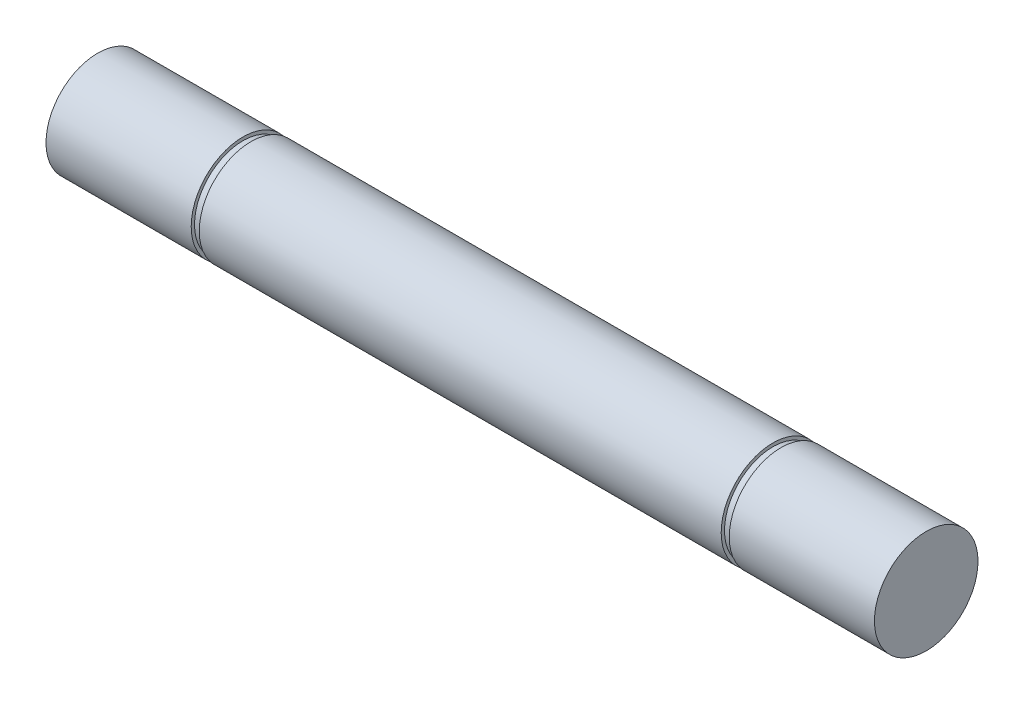
ISO-10303-21;
HEADER;
FILE_DESCRIPTION(('STEP AP214'),'2;1');
FILE_NAME('part.step','',(''),(''),'','','');
FILE_SCHEMA(('AUTOMOTIVE_DESIGN { 1 0 10303 214 1 1 1 1 }'));
ENDSEC;
DATA;
#1=APPLICATION_CONTEXT('core data for automotive mechanical design processes');
#2=APPLICATION_PROTOCOL_DEFINITION('international standard','automotive_design',2000,#1);
#3=PRODUCT_CONTEXT('',#1,'mechanical');
#4=PRODUCT('Part','Part','',(#3));
#5=PRODUCT_RELATED_PRODUCT_CATEGORY('part','',(#4));
#6=PRODUCT_DEFINITION_FORMATION('','',#4);
#7=PRODUCT_DEFINITION_CONTEXT('part definition',#1,'design');
#8=PRODUCT_DEFINITION('design','',#6,#7);
#9=PRODUCT_DEFINITION_SHAPE('','',#8);
#10=(LENGTH_UNIT() NAMED_UNIT(*) SI_UNIT(.MILLI.,.METRE.));
#11=(NAMED_UNIT(*) PLANE_ANGLE_UNIT() SI_UNIT($,.RADIAN.));
#12=(NAMED_UNIT(*) SI_UNIT($,.STERADIAN.) SOLID_ANGLE_UNIT());
#13=UNCERTAINTY_MEASURE_WITH_UNIT(LENGTH_MEASURE(1.E-05),#10,'distance_accuracy_value','');
#14=(GEOMETRIC_REPRESENTATION_CONTEXT(3) GLOBAL_UNCERTAINTY_ASSIGNED_CONTEXT((#13)) GLOBAL_UNIT_ASSIGNED_CONTEXT((#10,
#11,#12)) REPRESENTATION_CONTEXT('',''));
#15=CARTESIAN_POINT('',(0.,0.,0.));
#16=DIRECTION('',(0.,0.,1.));
#17=DIRECTION('',(1.,0.,0.));
#18=AXIS2_PLACEMENT_3D('',#15,#16,#17);
#19=CARTESIAN_POINT('',(101.6,0.,0.));
#20=DIRECTION('',(-1.,0.,0.));
#21=DIRECTION('',(0.,0.,1.));
#22=AXIS2_PLACEMENT_3D('',#19,#20,#21);
#23=CYLINDRICAL_SURFACE('',#22,6.35);
#24=CARTESIAN_POINT('',(18.796,0.,0.));
#25=DIRECTION('',(-1.,0.,0.));
#26=DIRECTION('',(0.,0.,1.));
#27=AXIS2_PLACEMENT_3D('',#24,#25,#26);
#28=CIRCLE('',#27,6.35);
#29=CARTESIAN_POINT('',(18.796,0.,6.35));
#30=VERTEX_POINT('',#29);
#31=EDGE_CURVE('E52',#30,#30,#28,.T.);
#32=ORIENTED_EDGE('',*,*,#31,.F.);
#33=EDGE_LOOP('',(#32));
#34=FACE_BOUND('',#33,.T.);
#35=CARTESIAN_POINT('',(82.804,0.,0.));
#36=DIRECTION('',(-1.,0.,0.));
#37=DIRECTION('',(0.,0.,1.));
#38=AXIS2_PLACEMENT_3D('',#35,#36,#37);
#39=CIRCLE('',#38,6.35);
#40=CARTESIAN_POINT('',(82.804,0.,6.35));
#41=VERTEX_POINT('',#40);
#42=EDGE_CURVE('E68',#41,#41,#39,.T.);
#43=ORIENTED_EDGE('',*,*,#42,.T.);
#44=EDGE_LOOP('',(#43));
#45=FACE_BOUND('',#44,.T.);
#46=ADVANCED_FACE('F37',(#34,#45),#23,.T.);
#47=CARTESIAN_POINT('',(17.8054,0.,0.));
#48=DIRECTION('',(-1.,0.,0.));
#49=DIRECTION('',(0.,0.,1.));
#50=AXIS2_PLACEMENT_3D('',#47,#48,#49);
#51=CIRCLE('',#50,6.35);
#52=CARTESIAN_POINT('',(17.8054,0.,6.35));
#53=VERTEX_POINT('',#52);
#54=EDGE_CURVE('E50',#53,#53,#51,.T.);
#55=ORIENTED_EDGE('',*,*,#54,.T.);
#56=EDGE_LOOP('',(#55));
#57=FACE_BOUND('',#56,.T.);
#58=CARTESIAN_POINT('',(0.,0.,0.));
#59=DIRECTION('',(1.,0.,0.));
#60=DIRECTION('',(0.,0.,-1.));
#61=AXIS2_PLACEMENT_3D('',#58,#59,#60);
#62=CIRCLE('',#61,6.35);
#63=CARTESIAN_POINT('',(0.,0.,-6.35));
#64=VERTEX_POINT('',#63);
#65=EDGE_CURVE('E41',#64,#64,#62,.T.);
#66=ORIENTED_EDGE('',*,*,#65,.T.);
#67=EDGE_LOOP('',(#66));
#68=FACE_BOUND('',#67,.T.);
#69=ADVANCED_FACE('F39',(#57,#68),#23,.T.);
#70=CARTESIAN_POINT('',(0.,0.,0.));
#71=DIRECTION('',(1.,0.,0.));
#72=DIRECTION('',(0.,0.,-1.));
#73=AXIS2_PLACEMENT_3D('',#70,#71,#72);
#74=PLANE('',#73);
#75=ORIENTED_EDGE('',*,*,#65,.F.);
#76=EDGE_LOOP('',(#75));
#77=FACE_BOUND('',#76,.T.);
#78=ADVANCED_FACE('F104',(#77),#74,.F.);
#79=CARTESIAN_POINT('',(17.8054,0.,0.));
#80=DIRECTION('',(-1.,0.,0.));
#81=DIRECTION('',(0.,0.,1.));
#82=AXIS2_PLACEMENT_3D('',#79,#80,#81);
#83=PLANE('',#82);
#84=ORIENTED_EDGE('',*,*,#54,.F.);
#85=EDGE_LOOP('',(#84));
#86=FACE_BOUND('',#85,.T.);
#87=CARTESIAN_POINT('',(17.8054,0.,0.));
#88=DIRECTION('',(-1.,0.,0.));
#89=DIRECTION('',(0.,0.,1.));
#90=AXIS2_PLACEMENT_3D('',#87,#88,#89);
#91=CIRCLE('',#90,5.9436);
#92=CARTESIAN_POINT('',(17.8054,0.,5.9436));
#93=VERTEX_POINT('',#92);
#94=EDGE_CURVE('E56',#93,#93,#91,.T.);
#95=ORIENTED_EDGE('',*,*,#94,.T.);
#96=EDGE_LOOP('',(#95));
#97=FACE_BOUND('',#96,.T.);
#98=ADVANCED_FACE('F126',(#86,#97),#83,.F.);
#99=CARTESIAN_POINT('',(18.796,0.,0.));
#100=DIRECTION('',(-1.,0.,0.));
#101=DIRECTION('',(0.,0.,1.));
#102=AXIS2_PLACEMENT_3D('',#99,#100,#101);
#103=PLANE('',#102);
#104=ORIENTED_EDGE('',*,*,#31,.T.);
#105=EDGE_LOOP('',(#104));
#106=FACE_BOUND('',#105,.T.);
#107=CARTESIAN_POINT('',(18.796,0.,0.));
#108=DIRECTION('',(-1.,0.,0.));
#109=DIRECTION('',(0.,0.,1.));
#110=AXIS2_PLACEMENT_3D('',#107,#108,#109);
#111=CIRCLE('',#110,5.9436);
#112=CARTESIAN_POINT('',(18.796,0.,5.9436));
#113=VERTEX_POINT('',#112);
#114=EDGE_CURVE('E60',#113,#113,#111,.T.);
#115=ORIENTED_EDGE('',*,*,#114,.F.);
#116=EDGE_LOOP('',(#115));
#117=FACE_BOUND('',#116,.T.);
#118=ADVANCED_FACE('F124',(#106,#117),#103,.T.);
#119=CARTESIAN_POINT('',(17.8054,0.,0.));
#120=DIRECTION('',(1.,0.,0.));
#121=DIRECTION('',(0.,0.,-1.));
#122=AXIS2_PLACEMENT_3D('',#119,#120,#121);
#123=CYLINDRICAL_SURFACE('',#122,5.9436);
#124=ORIENTED_EDGE('',*,*,#94,.F.);
#125=EDGE_LOOP('',(#124));
#126=FACE_BOUND('',#125,.T.);
#127=ORIENTED_EDGE('',*,*,#114,.T.);
#128=EDGE_LOOP('',(#127));
#129=FACE_BOUND('',#128,.T.);
#130=ADVANCED_FACE('F91',(#126,#129),#123,.T.);
#131=CARTESIAN_POINT('',(83.7946,0.,0.));
#132=DIRECTION('',(1.,0.,0.));
#133=DIRECTION('',(0.,0.,1.));
#134=AXIS2_PLACEMENT_3D('',#131,#132,#133);
#135=PLANE('',#134);
#136=CARTESIAN_POINT('',(83.7946,0.,0.));
#137=DIRECTION('',(-1.,0.,0.));
#138=DIRECTION('',(0.,0.,1.));
#139=AXIS2_PLACEMENT_3D('',#136,#137,#138);
#140=CIRCLE('',#139,5.9436);
#141=CARTESIAN_POINT('',(83.7946,0.,5.9436));
#142=VERTEX_POINT('',#141);
#143=EDGE_CURVE('E72',#142,#142,#140,.T.);
#144=ORIENTED_EDGE('',*,*,#143,.F.);
#145=EDGE_LOOP('',(#144));
#146=FACE_BOUND('',#145,.T.);
#147=CARTESIAN_POINT('',(83.7946,0.,0.));
#148=DIRECTION('',(-1.,0.,0.));
#149=DIRECTION('',(0.,0.,1.));
#150=AXIS2_PLACEMENT_3D('',#147,#148,#149);
#151=CIRCLE('',#150,6.35);
#152=CARTESIAN_POINT('',(83.7946,0.,6.35));
#153=VERTEX_POINT('',#152);
#154=EDGE_CURVE('E64',#153,#153,#151,.T.);
#155=ORIENTED_EDGE('',*,*,#154,.T.);
#156=EDGE_LOOP('',(#155));
#157=FACE_BOUND('',#156,.T.);
#158=ADVANCED_FACE('F87',(#146,#157),#135,.F.);
#159=CARTESIAN_POINT('',(82.804,0.,0.));
#160=DIRECTION('',(1.,0.,0.));
#161=DIRECTION('',(0.,0.,1.));
#162=AXIS2_PLACEMENT_3D('',#159,#160,#161);
#163=PLANE('',#162);
#164=CARTESIAN_POINT('',(82.804,0.,0.));
#165=DIRECTION('',(-1.,0.,0.));
#166=DIRECTION('',(0.,0.,1.));
#167=AXIS2_PLACEMENT_3D('',#164,#165,#166);
#168=CIRCLE('',#167,5.9436);
#169=CARTESIAN_POINT('',(82.804,0.,5.9436));
#170=VERTEX_POINT('',#169);
#171=EDGE_CURVE('E76',#170,#170,#168,.T.);
#172=ORIENTED_EDGE('',*,*,#171,.T.);
#173=EDGE_LOOP('',(#172));
#174=FACE_BOUND('',#173,.T.);
#175=ORIENTED_EDGE('',*,*,#42,.F.);
#176=EDGE_LOOP('',(#175));
#177=FACE_BOUND('',#176,.T.);
#178=ADVANCED_FACE('F90',(#174,#177),#163,.T.);
#179=CARTESIAN_POINT('',(83.7946,0.,0.));
#180=DIRECTION('',(-1.,0.,0.));
#181=DIRECTION('',(0.,0.,1.));
#182=AXIS2_PLACEMENT_3D('',#179,#180,#181);
#183=CYLINDRICAL_SURFACE('',#182,5.9436);
#184=ORIENTED_EDGE('',*,*,#143,.T.);
#185=EDGE_LOOP('',(#184));
#186=FACE_BOUND('',#185,.T.);
#187=ORIENTED_EDGE('',*,*,#171,.F.);
#188=EDGE_LOOP('',(#187));
#189=FACE_BOUND('',#188,.T.);
#190=ADVANCED_FACE('F84',(#186,#189),#183,.T.);
#191=CARTESIAN_POINT('',(101.6,0.,0.));
#192=DIRECTION('',(1.,0.,0.));
#193=DIRECTION('',(0.,0.,-1.));
#194=AXIS2_PLACEMENT_3D('',#191,#192,#193);
#195=PLANE('',#194);
#196=CARTESIAN_POINT('',(101.6,0.,0.));
#197=DIRECTION('',(1.,0.,0.));
#198=DIRECTION('',(0.,0.,-1.));
#199=AXIS2_PLACEMENT_3D('',#196,#197,#198);
#200=CIRCLE('',#199,6.35);
#201=CARTESIAN_POINT('',(101.6,0.,-6.35));
#202=VERTEX_POINT('',#201);
#203=EDGE_CURVE('E10',#202,#202,#200,.T.);
#204=ORIENTED_EDGE('',*,*,#203,.T.);
#205=EDGE_LOOP('',(#204));
#206=FACE_BOUND('',#205,.T.);
#207=ADVANCED_FACE('F98',(#206),#195,.T.);
#208=ORIENTED_EDGE('',*,*,#154,.F.);
#209=EDGE_LOOP('',(#208));
#210=FACE_BOUND('',#209,.T.);
#211=ORIENTED_EDGE('',*,*,#203,.F.);
#212=EDGE_LOOP('',(#211));
#213=FACE_BOUND('',#212,.T.);
#214=ADVANCED_FACE('F95',(#210,#213),#23,.T.);
#215=CLOSED_SHELL('',(#46,#69,#78,#98,#118,#130,#158,#178,#190,#207,#214));
#216=MANIFOLD_SOLID_BREP('B2',#215);
#217=ADVANCED_BREP_SHAPE_REPRESENTATION('',(#18,#216),#14);
#218=SHAPE_DEFINITION_REPRESENTATION(#9,#217);
ENDSEC;
END-ISO-10303-21;
